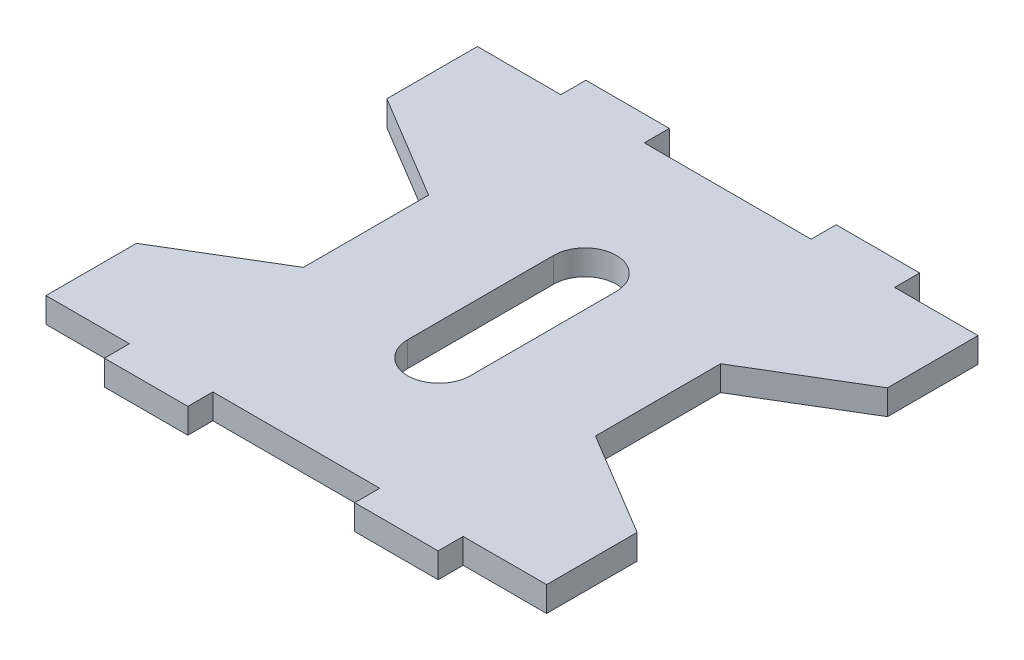
ISO-10303-21;
HEADER;
FILE_DESCRIPTION(('STEP AP214'),'2;1');
FILE_NAME('part.step','',(''),(''),'','','');
FILE_SCHEMA(('AUTOMOTIVE_DESIGN { 1 0 10303 214 1 1 1 1 }'));
ENDSEC;
DATA;
#1=APPLICATION_CONTEXT('core data for automotive mechanical design processes');
#2=APPLICATION_PROTOCOL_DEFINITION('international standard','automotive_design',2000,#1);
#3=PRODUCT_CONTEXT('',#1,'mechanical');
#4=PRODUCT('Part','Part','',(#3));
#5=PRODUCT_RELATED_PRODUCT_CATEGORY('part','',(#4));
#6=PRODUCT_DEFINITION_FORMATION('','',#4);
#7=PRODUCT_DEFINITION_CONTEXT('part definition',#1,'design');
#8=PRODUCT_DEFINITION('design','',#6,#7);
#9=PRODUCT_DEFINITION_SHAPE('','',#8);
#10=(LENGTH_UNIT() NAMED_UNIT(*) SI_UNIT(.MILLI.,.METRE.));
#11=(NAMED_UNIT(*) PLANE_ANGLE_UNIT() SI_UNIT($,.RADIAN.));
#12=(NAMED_UNIT(*) SI_UNIT($,.STERADIAN.) SOLID_ANGLE_UNIT());
#13=UNCERTAINTY_MEASURE_WITH_UNIT(LENGTH_MEASURE(1.E-05),#10,'distance_accuracy_value','');
#14=(GEOMETRIC_REPRESENTATION_CONTEXT(3) GLOBAL_UNCERTAINTY_ASSIGNED_CONTEXT((#13)) GLOBAL_UNIT_ASSIGNED_CONTEXT((#10,
#11,#12)) REPRESENTATION_CONTEXT('',''));
#15=CARTESIAN_POINT('',(0.,0.,0.));
#16=DIRECTION('',(0.,0.,1.));
#17=DIRECTION('',(1.,0.,0.));
#18=AXIS2_PLACEMENT_3D('',#15,#16,#17);
#19=CARTESIAN_POINT('',(0.,3.,0.));
#20=DIRECTION('',(0.,-1.,0.));
#21=DIRECTION('',(0.,0.,-1.));
#22=AXIS2_PLACEMENT_3D('',#19,#20,#21);
#23=PLANE('',#22);
#24=DIRECTION('',(0.,0.,1.));
#25=VECTOR('',#24,1.);
#26=CARTESIAN_POINT('',(10.,3.,-25.85));
#27=LINE('',#26,#25);
#28=CARTESIAN_POINT('',(10.,3.,-28.85));
#29=VERTEX_POINT('',#28);
#30=CARTESIAN_POINT('',(10.,3.,-25.85));
#31=VERTEX_POINT('',#30);
#32=EDGE_CURVE('E297',#29,#31,#27,.T.);
#33=ORIENTED_EDGE('',*,*,#32,.T.);
#34=DIRECTION('',(-1.,0.,0.));
#35=VECTOR('',#34,1.);
#36=CARTESIAN_POINT('',(-10.,3.,-25.85));
#37=LINE('',#36,#35);
#38=CARTESIAN_POINT('',(-10.,3.,-25.85));
#39=VERTEX_POINT('',#38);
#40=EDGE_CURVE('E301',#31,#39,#37,.T.);
#41=ORIENTED_EDGE('',*,*,#40,.T.);
#42=DIRECTION('',(0.,0.,-1.));
#43=VECTOR('',#42,1.);
#44=CARTESIAN_POINT('',(-10.,3.,-25.85));
#45=LINE('',#44,#43);
#46=CARTESIAN_POINT('',(-10.,3.,-28.85));
#47=VERTEX_POINT('',#46);
#48=EDGE_CURVE('E305',#39,#47,#45,.T.);
#49=ORIENTED_EDGE('',*,*,#48,.T.);
#50=DIRECTION('',(-1.,0.,0.));
#51=VECTOR('',#50,1.);
#52=CARTESIAN_POINT('',(-10.,3.,-28.85));
#53=LINE('',#52,#51);
#54=CARTESIAN_POINT('',(-20.,3.,-28.85));
#55=VERTEX_POINT('',#54);
#56=EDGE_CURVE('E308',#47,#55,#53,.T.);
#57=ORIENTED_EDGE('',*,*,#56,.T.);
#58=DIRECTION('',(0.,0.,1.));
#59=VECTOR('',#58,1.);
#60=CARTESIAN_POINT('',(-20.,3.,-28.85));
#61=LINE('',#60,#59);
#62=CARTESIAN_POINT('',(-20.,3.,-25.85));
#63=VERTEX_POINT('',#62);
#64=EDGE_CURVE('E311',#55,#63,#61,.T.);
#65=ORIENTED_EDGE('',*,*,#64,.T.);
#66=DIRECTION('',(-1.,0.,0.));
#67=VECTOR('',#66,1.);
#68=CARTESIAN_POINT('',(-20.,3.,-25.85));
#69=LINE('',#68,#67);
#70=CARTESIAN_POINT('',(-30.,3.,-25.85));
#71=VERTEX_POINT('',#70);
#72=EDGE_CURVE('E314',#63,#71,#69,.T.);
#73=ORIENTED_EDGE('',*,*,#72,.T.);
#74=DIRECTION('',(0.,0.,1.));
#75=VECTOR('',#74,1.);
#76=CARTESIAN_POINT('',(-30.,3.,-25.85));
#77=LINE('',#76,#75);
#78=CARTESIAN_POINT('',(-30.,3.,-15.));
#79=VERTEX_POINT('',#78);
#80=EDGE_CURVE('E317',#71,#79,#77,.T.);
#81=ORIENTED_EDGE('',*,*,#80,.T.);
#82=DIRECTION('',(0.857492925712544,0.,0.514495755427526));
#83=VECTOR('',#82,1.);
#84=CARTESIAN_POINT('',(-30.,3.,-15.));
#85=LINE('',#84,#83);
#86=CARTESIAN_POINT('',(-17.5,3.,-7.5));
#87=VERTEX_POINT('',#86);
#88=EDGE_CURVE('E320',#79,#87,#85,.T.);
#89=ORIENTED_EDGE('',*,*,#88,.T.);
#90=DIRECTION('',(0.,0.,1.));
#91=VECTOR('',#90,1.);
#92=CARTESIAN_POINT('',(-17.5,3.,-7.5));
#93=LINE('',#92,#91);
#94=CARTESIAN_POINT('',(-17.5,3.,7.5));
#95=VERTEX_POINT('',#94);
#96=EDGE_CURVE('E323',#87,#95,#93,.T.);
#97=ORIENTED_EDGE('',*,*,#96,.T.);
#98=DIRECTION('',(-0.857492925712544,0.,0.514495755427527));
#99=VECTOR('',#98,1.);
#100=CARTESIAN_POINT('',(-30.,3.,15.));
#101=LINE('',#100,#99);
#102=CARTESIAN_POINT('',(-30.,3.,15.));
#103=VERTEX_POINT('',#102);
#104=EDGE_CURVE('E326',#95,#103,#101,.T.);
#105=ORIENTED_EDGE('',*,*,#104,.T.);
#106=DIRECTION('',(0.,0.,1.));
#107=VECTOR('',#106,1.);
#108=CARTESIAN_POINT('',(-30.,3.,25.85));
#109=LINE('',#108,#107);
#110=CARTESIAN_POINT('',(-30.,3.,25.85));
#111=VERTEX_POINT('',#110);
#112=EDGE_CURVE('E329',#103,#111,#109,.T.);
#113=ORIENTED_EDGE('',*,*,#112,.T.);
#114=DIRECTION('',(1.,0.,0.));
#115=VECTOR('',#114,1.);
#116=CARTESIAN_POINT('',(-20.,3.,25.85));
#117=LINE('',#116,#115);
#118=CARTESIAN_POINT('',(-20.,3.,25.85));
#119=VERTEX_POINT('',#118);
#120=EDGE_CURVE('E332',#111,#119,#117,.T.);
#121=ORIENTED_EDGE('',*,*,#120,.T.);
#122=DIRECTION('',(0.,0.,1.));
#123=VECTOR('',#122,1.);
#124=CARTESIAN_POINT('',(-20.,3.,28.85));
#125=LINE('',#124,#123);
#126=CARTESIAN_POINT('',(-20.,3.,28.85));
#127=VERTEX_POINT('',#126);
#128=EDGE_CURVE('E335',#119,#127,#125,.T.);
#129=ORIENTED_EDGE('',*,*,#128,.T.);
#130=DIRECTION('',(1.,0.,0.));
#131=VECTOR('',#130,1.);
#132=CARTESIAN_POINT('',(-10.,3.,28.85));
#133=LINE('',#132,#131);
#134=CARTESIAN_POINT('',(-10.,3.,28.85));
#135=VERTEX_POINT('',#134);
#136=EDGE_CURVE('E338',#127,#135,#133,.T.);
#137=ORIENTED_EDGE('',*,*,#136,.T.);
#138=DIRECTION('',(0.,0.,-1.));
#139=VECTOR('',#138,1.);
#140=CARTESIAN_POINT('',(-10.,3.,25.85));
#141=LINE('',#140,#139);
#142=CARTESIAN_POINT('',(-10.,3.,25.85));
#143=VERTEX_POINT('',#142);
#144=EDGE_CURVE('E341',#135,#143,#141,.T.);
#145=ORIENTED_EDGE('',*,*,#144,.T.);
#146=DIRECTION('',(1.,0.,0.));
#147=VECTOR('',#146,1.);
#148=CARTESIAN_POINT('',(-10.,3.,25.85));
#149=LINE('',#148,#147);
#150=CARTESIAN_POINT('',(10.,3.,25.85));
#151=VERTEX_POINT('',#150);
#152=EDGE_CURVE('E344',#143,#151,#149,.T.);
#153=ORIENTED_EDGE('',*,*,#152,.T.);
#154=DIRECTION('',(0.,0.,1.));
#155=VECTOR('',#154,1.);
#156=CARTESIAN_POINT('',(10.,3.,25.85));
#157=LINE('',#156,#155);
#158=CARTESIAN_POINT('',(10.,3.,28.85));
#159=VERTEX_POINT('',#158);
#160=EDGE_CURVE('E347',#151,#159,#157,.T.);
#161=ORIENTED_EDGE('',*,*,#160,.T.);
#162=DIRECTION('',(1.,0.,0.));
#163=VECTOR('',#162,1.);
#164=CARTESIAN_POINT('',(10.,3.,28.85));
#165=LINE('',#164,#163);
#166=CARTESIAN_POINT('',(20.,3.,28.85));
#167=VERTEX_POINT('',#166);
#168=EDGE_CURVE('E350',#159,#167,#165,.T.);
#169=ORIENTED_EDGE('',*,*,#168,.T.);
#170=DIRECTION('',(0.,0.,-1.));
#171=VECTOR('',#170,1.);
#172=CARTESIAN_POINT('',(20.,3.,28.85));
#173=LINE('',#172,#171);
#174=CARTESIAN_POINT('',(20.,3.,25.85));
#175=VERTEX_POINT('',#174);
#176=EDGE_CURVE('E353',#167,#175,#173,.T.);
#177=ORIENTED_EDGE('',*,*,#176,.T.);
#178=DIRECTION('',(1.,0.,0.));
#179=VECTOR('',#178,1.);
#180=CARTESIAN_POINT('',(20.,3.,25.85));
#181=LINE('',#180,#179);
#182=CARTESIAN_POINT('',(30.,3.,25.85));
#183=VERTEX_POINT('',#182);
#184=EDGE_CURVE('E356',#175,#183,#181,.T.);
#185=ORIENTED_EDGE('',*,*,#184,.T.);
#186=DIRECTION('',(0.,0.,-1.));
#187=VECTOR('',#186,1.);
#188=CARTESIAN_POINT('',(30.,3.,25.85));
#189=LINE('',#188,#187);
#190=CARTESIAN_POINT('',(30.,3.,15.));
#191=VERTEX_POINT('',#190);
#192=EDGE_CURVE('E359',#183,#191,#189,.T.);
#193=ORIENTED_EDGE('',*,*,#192,.T.);
#194=DIRECTION('',(-0.857492925712544,0.,-0.514495755427526));
#195=VECTOR('',#194,1.);
#196=CARTESIAN_POINT('',(30.,3.,15.));
#197=LINE('',#196,#195);
#198=CARTESIAN_POINT('',(17.5,3.,7.49999999999999));
#199=VERTEX_POINT('',#198);
#200=EDGE_CURVE('E362',#191,#199,#197,.T.);
#201=ORIENTED_EDGE('',*,*,#200,.T.);
#202=DIRECTION('',(0.,0.,-1.));
#203=VECTOR('',#202,1.);
#204=CARTESIAN_POINT('',(17.5,3.,-7.5));
#205=LINE('',#204,#203);
#206=CARTESIAN_POINT('',(17.5,3.,-7.5));
#207=VERTEX_POINT('',#206);
#208=EDGE_CURVE('E365',#199,#207,#205,.T.);
#209=ORIENTED_EDGE('',*,*,#208,.T.);
#210=DIRECTION('',(0.857492925712544,0.,-0.514495755427526));
#211=VECTOR('',#210,1.);
#212=CARTESIAN_POINT('',(30.,3.,-15.));
#213=LINE('',#212,#211);
#214=CARTESIAN_POINT('',(30.,3.,-15.));
#215=VERTEX_POINT('',#214);
#216=EDGE_CURVE('E368',#207,#215,#213,.T.);
#217=ORIENTED_EDGE('',*,*,#216,.T.);
#218=DIRECTION('',(0.,0.,-1.));
#219=VECTOR('',#218,1.);
#220=CARTESIAN_POINT('',(30.,3.,-25.85));
#221=LINE('',#220,#219);
#222=CARTESIAN_POINT('',(30.,3.,-25.85));
#223=VERTEX_POINT('',#222);
#224=EDGE_CURVE('E371',#215,#223,#221,.T.);
#225=ORIENTED_EDGE('',*,*,#224,.T.);
#226=DIRECTION('',(-1.,0.,0.));
#227=VECTOR('',#226,1.);
#228=CARTESIAN_POINT('',(20.,3.,-25.85));
#229=LINE('',#228,#227);
#230=CARTESIAN_POINT('',(20.,3.,-25.85));
#231=VERTEX_POINT('',#230);
#232=EDGE_CURVE('E374',#223,#231,#229,.T.);
#233=ORIENTED_EDGE('',*,*,#232,.T.);
#234=DIRECTION('',(0.,0.,-1.));
#235=VECTOR('',#234,1.);
#236=CARTESIAN_POINT('',(20.,3.,-28.85));
#237=LINE('',#236,#235);
#238=CARTESIAN_POINT('',(20.,3.,-28.85));
#239=VERTEX_POINT('',#238);
#240=EDGE_CURVE('E377',#231,#239,#237,.T.);
#241=ORIENTED_EDGE('',*,*,#240,.T.);
#242=DIRECTION('',(-1.,0.,0.));
#243=VECTOR('',#242,1.);
#244=CARTESIAN_POINT('',(10.,3.,-28.85));
#245=LINE('',#244,#243);
#246=EDGE_CURVE('E380',#239,#29,#245,.T.);
#247=ORIENTED_EDGE('',*,*,#246,.T.);
#248=EDGE_LOOP('',(#33,#41,#49,#57,#65,#73,#81,#89,#97,#105,#113,#121,#129,#137,#145,#153,#161,
#169,#177,#185,#193,#201,#209,#217,#225,#233,#241,#247));
#249=FACE_BOUND('',#248,.T.);
#250=CARTESIAN_POINT('',(0.,3.,8.75));
#251=DIRECTION('',(0.,1.,0.));
#252=DIRECTION('',(0.,0.,-1.));
#253=AXIS2_PLACEMENT_3D('',#250,#251,#252);
#254=CIRCLE('',#253,3.75000000000001);
#255=CARTESIAN_POINT('',(-3.75000000000002,3.,8.75));
#256=VERTEX_POINT('',#255);
#257=CARTESIAN_POINT('',(3.75,3.,8.75));
#258=VERTEX_POINT('',#257);
#259=EDGE_CURVE('E249',#256,#258,#254,.T.);
#260=ORIENTED_EDGE('',*,*,#259,.F.);
#261=DIRECTION('',(0.,0.,1.));
#262=VECTOR('',#261,1.);
#263=CARTESIAN_POINT('',(-3.75000000000002,3.,8.75));
#264=LINE('',#263,#262);
#265=CARTESIAN_POINT('',(-3.75000000000002,3.,-8.75));
#266=VERTEX_POINT('',#265);
#267=EDGE_CURVE('E275',#266,#256,#264,.T.);
#268=ORIENTED_EDGE('',*,*,#267,.F.);
#269=CARTESIAN_POINT('',(0.,3.,-8.75));
#270=DIRECTION('',(0.,1.,0.));
#271=DIRECTION('',(0.,0.,1.));
#272=AXIS2_PLACEMENT_3D('',#269,#270,#271);
#273=CIRCLE('',#272,3.75000000000001);
#274=CARTESIAN_POINT('',(3.75,3.,-8.75));
#275=VERTEX_POINT('',#274);
#276=EDGE_CURVE('E271',#275,#266,#273,.T.);
#277=ORIENTED_EDGE('',*,*,#276,.F.);
#278=DIRECTION('',(0.,0.,-1.));
#279=VECTOR('',#278,1.);
#280=CARTESIAN_POINT('',(3.75,3.,8.75));
#281=LINE('',#280,#279);
#282=EDGE_CURVE('E258',#258,#275,#281,.T.);
#283=ORIENTED_EDGE('',*,*,#282,.F.);
#284=EDGE_LOOP('',(#260,#268,#277,#283));
#285=FACE_BOUND('',#284,.T.);
#286=ADVANCED_FACE('F39',(#249,#285),#23,.F.);
#287=CARTESIAN_POINT('',(0.,0.,0.));
#288=DIRECTION('',(0.,-1.,0.));
#289=DIRECTION('',(0.,0.,-1.));
#290=AXIS2_PLACEMENT_3D('',#287,#288,#289);
#291=PLANE('',#290);
#292=DIRECTION('',(0.,0.,1.));
#293=VECTOR('',#292,1.);
#294=CARTESIAN_POINT('',(10.,0.,-25.85));
#295=LINE('',#294,#293);
#296=CARTESIAN_POINT('',(10.,0.,-28.85));
#297=VERTEX_POINT('',#296);
#298=CARTESIAN_POINT('',(10.,0.,-25.85));
#299=VERTEX_POINT('',#298);
#300=EDGE_CURVE('E267',#297,#299,#295,.T.);
#301=ORIENTED_EDGE('',*,*,#300,.F.);
#302=DIRECTION('',(-1.,0.,0.));
#303=VECTOR('',#302,1.);
#304=CARTESIAN_POINT('',(10.,0.,-28.85));
#305=LINE('',#304,#303);
#306=CARTESIAN_POINT('',(20.,0.,-28.85));
#307=VERTEX_POINT('',#306);
#308=EDGE_CURVE('E302',#307,#297,#305,.T.);
#309=ORIENTED_EDGE('',*,*,#308,.F.);
#310=DIRECTION('',(0.,0.,-1.));
#311=VECTOR('',#310,1.);
#312=CARTESIAN_POINT('',(20.,0.,-28.85));
#313=LINE('',#312,#311);
#314=CARTESIAN_POINT('',(20.,0.,-25.85));
#315=VERTEX_POINT('',#314);
#316=EDGE_CURVE('E462',#315,#307,#313,.T.);
#317=ORIENTED_EDGE('',*,*,#316,.F.);
#318=DIRECTION('',(-1.,0.,0.));
#319=VECTOR('',#318,1.);
#320=CARTESIAN_POINT('',(20.,0.,-25.85));
#321=LINE('',#320,#319);
#322=CARTESIAN_POINT('',(30.,0.,-25.85));
#323=VERTEX_POINT('',#322);
#324=EDGE_CURVE('E459',#323,#315,#321,.T.);
#325=ORIENTED_EDGE('',*,*,#324,.F.);
#326=DIRECTION('',(0.,0.,-1.));
#327=VECTOR('',#326,1.);
#328=CARTESIAN_POINT('',(30.,0.,-25.85));
#329=LINE('',#328,#327);
#330=CARTESIAN_POINT('',(30.,0.,-15.));
#331=VERTEX_POINT('',#330);
#332=EDGE_CURVE('E456',#331,#323,#329,.T.);
#333=ORIENTED_EDGE('',*,*,#332,.F.);
#334=DIRECTION('',(0.857492925712544,0.,-0.514495755427526));
#335=VECTOR('',#334,1.);
#336=CARTESIAN_POINT('',(30.,0.,-15.));
#337=LINE('',#336,#335);
#338=CARTESIAN_POINT('',(17.5,0.,-7.5));
#339=VERTEX_POINT('',#338);
#340=EDGE_CURVE('E453',#339,#331,#337,.T.);
#341=ORIENTED_EDGE('',*,*,#340,.F.);
#342=DIRECTION('',(0.,0.,-1.));
#343=VECTOR('',#342,1.);
#344=CARTESIAN_POINT('',(17.5,0.,-7.5));
#345=LINE('',#344,#343);
#346=CARTESIAN_POINT('',(17.5,0.,7.49999999999999));
#347=VERTEX_POINT('',#346);
#348=EDGE_CURVE('E450',#347,#339,#345,.T.);
#349=ORIENTED_EDGE('',*,*,#348,.F.);
#350=DIRECTION('',(-0.857492925712544,0.,-0.514495755427526));
#351=VECTOR('',#350,1.);
#352=CARTESIAN_POINT('',(30.,0.,15.));
#353=LINE('',#352,#351);
#354=CARTESIAN_POINT('',(30.,0.,15.));
#355=VERTEX_POINT('',#354);
#356=EDGE_CURVE('E447',#355,#347,#353,.T.);
#357=ORIENTED_EDGE('',*,*,#356,.F.);
#358=DIRECTION('',(0.,0.,-1.));
#359=VECTOR('',#358,1.);
#360=CARTESIAN_POINT('',(30.,0.,25.85));
#361=LINE('',#360,#359);
#362=CARTESIAN_POINT('',(30.,0.,25.85));
#363=VERTEX_POINT('',#362);
#364=EDGE_CURVE('E444',#363,#355,#361,.T.);
#365=ORIENTED_EDGE('',*,*,#364,.F.);
#366=DIRECTION('',(1.,0.,0.));
#367=VECTOR('',#366,1.);
#368=CARTESIAN_POINT('',(20.,0.,25.85));
#369=LINE('',#368,#367);
#370=CARTESIAN_POINT('',(20.,0.,25.85));
#371=VERTEX_POINT('',#370);
#372=EDGE_CURVE('E441',#371,#363,#369,.T.);
#373=ORIENTED_EDGE('',*,*,#372,.F.);
#374=DIRECTION('',(0.,0.,-1.));
#375=VECTOR('',#374,1.);
#376=CARTESIAN_POINT('',(20.,0.,28.85));
#377=LINE('',#376,#375);
#378=CARTESIAN_POINT('',(20.,0.,28.85));
#379=VERTEX_POINT('',#378);
#380=EDGE_CURVE('E438',#379,#371,#377,.T.);
#381=ORIENTED_EDGE('',*,*,#380,.F.);
#382=DIRECTION('',(1.,0.,0.));
#383=VECTOR('',#382,1.);
#384=CARTESIAN_POINT('',(10.,0.,28.85));
#385=LINE('',#384,#383);
#386=CARTESIAN_POINT('',(10.,0.,28.85));
#387=VERTEX_POINT('',#386);
#388=EDGE_CURVE('E435',#387,#379,#385,.T.);
#389=ORIENTED_EDGE('',*,*,#388,.F.);
#390=DIRECTION('',(0.,0.,1.));
#391=VECTOR('',#390,1.);
#392=CARTESIAN_POINT('',(10.,0.,25.85));
#393=LINE('',#392,#391);
#394=CARTESIAN_POINT('',(10.,0.,25.85));
#395=VERTEX_POINT('',#394);
#396=EDGE_CURVE('E432',#395,#387,#393,.T.);
#397=ORIENTED_EDGE('',*,*,#396,.F.);
#398=DIRECTION('',(1.,0.,0.));
#399=VECTOR('',#398,1.);
#400=CARTESIAN_POINT('',(-10.,0.,25.85));
#401=LINE('',#400,#399);
#402=CARTESIAN_POINT('',(-10.,0.,25.85));
#403=VERTEX_POINT('',#402);
#404=EDGE_CURVE('E429',#403,#395,#401,.T.);
#405=ORIENTED_EDGE('',*,*,#404,.F.);
#406=DIRECTION('',(0.,0.,-1.));
#407=VECTOR('',#406,1.);
#408=CARTESIAN_POINT('',(-10.,0.,25.85));
#409=LINE('',#408,#407);
#410=CARTESIAN_POINT('',(-10.,0.,28.85));
#411=VERTEX_POINT('',#410);
#412=EDGE_CURVE('E426',#411,#403,#409,.T.);
#413=ORIENTED_EDGE('',*,*,#412,.F.);
#414=DIRECTION('',(1.,0.,0.));
#415=VECTOR('',#414,1.);
#416=CARTESIAN_POINT('',(-10.,0.,28.85));
#417=LINE('',#416,#415);
#418=CARTESIAN_POINT('',(-20.,0.,28.85));
#419=VERTEX_POINT('',#418);
#420=EDGE_CURVE('E423',#419,#411,#417,.T.);
#421=ORIENTED_EDGE('',*,*,#420,.F.);
#422=DIRECTION('',(0.,0.,1.));
#423=VECTOR('',#422,1.);
#424=CARTESIAN_POINT('',(-20.,0.,28.85));
#425=LINE('',#424,#423);
#426=CARTESIAN_POINT('',(-20.,0.,25.85));
#427=VERTEX_POINT('',#426);
#428=EDGE_CURVE('E420',#427,#419,#425,.T.);
#429=ORIENTED_EDGE('',*,*,#428,.F.);
#430=DIRECTION('',(1.,0.,0.));
#431=VECTOR('',#430,1.);
#432=CARTESIAN_POINT('',(-20.,0.,25.85));
#433=LINE('',#432,#431);
#434=CARTESIAN_POINT('',(-30.,0.,25.85));
#435=VERTEX_POINT('',#434);
#436=EDGE_CURVE('E417',#435,#427,#433,.T.);
#437=ORIENTED_EDGE('',*,*,#436,.F.);
#438=DIRECTION('',(0.,0.,1.));
#439=VECTOR('',#438,1.);
#440=CARTESIAN_POINT('',(-30.,0.,25.85));
#441=LINE('',#440,#439);
#442=CARTESIAN_POINT('',(-30.,0.,15.));
#443=VERTEX_POINT('',#442);
#444=EDGE_CURVE('E414',#443,#435,#441,.T.);
#445=ORIENTED_EDGE('',*,*,#444,.F.);
#446=DIRECTION('',(-0.857492925712544,0.,0.514495755427527));
#447=VECTOR('',#446,1.);
#448=CARTESIAN_POINT('',(-30.,0.,15.));
#449=LINE('',#448,#447);
#450=CARTESIAN_POINT('',(-17.5,0.,7.5));
#451=VERTEX_POINT('',#450);
#452=EDGE_CURVE('E411',#451,#443,#449,.T.);
#453=ORIENTED_EDGE('',*,*,#452,.F.);
#454=DIRECTION('',(0.,0.,1.));
#455=VECTOR('',#454,1.);
#456=CARTESIAN_POINT('',(-17.5,0.,-7.5));
#457=LINE('',#456,#455);
#458=CARTESIAN_POINT('',(-17.5,0.,-7.5));
#459=VERTEX_POINT('',#458);
#460=EDGE_CURVE('E408',#459,#451,#457,.T.);
#461=ORIENTED_EDGE('',*,*,#460,.F.);
#462=DIRECTION('',(0.857492925712544,0.,0.514495755427526));
#463=VECTOR('',#462,1.);
#464=CARTESIAN_POINT('',(-30.,0.,-15.));
#465=LINE('',#464,#463);
#466=CARTESIAN_POINT('',(-30.,0.,-15.));
#467=VERTEX_POINT('',#466);
#468=EDGE_CURVE('E405',#467,#459,#465,.T.);
#469=ORIENTED_EDGE('',*,*,#468,.F.);
#470=DIRECTION('',(0.,0.,1.));
#471=VECTOR('',#470,1.);
#472=CARTESIAN_POINT('',(-30.,0.,-25.85));
#473=LINE('',#472,#471);
#474=CARTESIAN_POINT('',(-30.,0.,-25.85));
#475=VERTEX_POINT('',#474);
#476=EDGE_CURVE('E402',#475,#467,#473,.T.);
#477=ORIENTED_EDGE('',*,*,#476,.F.);
#478=DIRECTION('',(-1.,0.,0.));
#479=VECTOR('',#478,1.);
#480=CARTESIAN_POINT('',(-20.,0.,-25.85));
#481=LINE('',#480,#479);
#482=CARTESIAN_POINT('',(-20.,0.,-25.85));
#483=VERTEX_POINT('',#482);
#484=EDGE_CURVE('E399',#483,#475,#481,.T.);
#485=ORIENTED_EDGE('',*,*,#484,.F.);
#486=DIRECTION('',(0.,0.,1.));
#487=VECTOR('',#486,1.);
#488=CARTESIAN_POINT('',(-20.,0.,-28.85));
#489=LINE('',#488,#487);
#490=CARTESIAN_POINT('',(-20.,0.,-28.85));
#491=VERTEX_POINT('',#490);
#492=EDGE_CURVE('E396',#491,#483,#489,.T.);
#493=ORIENTED_EDGE('',*,*,#492,.F.);
#494=DIRECTION('',(-1.,0.,0.));
#495=VECTOR('',#494,1.);
#496=CARTESIAN_POINT('',(-10.,0.,-28.85));
#497=LINE('',#496,#495);
#498=CARTESIAN_POINT('',(-10.,0.,-28.85));
#499=VERTEX_POINT('',#498);
#500=EDGE_CURVE('E393',#499,#491,#497,.T.);
#501=ORIENTED_EDGE('',*,*,#500,.F.);
#502=DIRECTION('',(0.,0.,-1.));
#503=VECTOR('',#502,1.);
#504=CARTESIAN_POINT('',(-10.,0.,-25.85));
#505=LINE('',#504,#503);
#506=CARTESIAN_POINT('',(-10.,0.,-25.85));
#507=VERTEX_POINT('',#506);
#508=EDGE_CURVE('E390',#507,#499,#505,.T.);
#509=ORIENTED_EDGE('',*,*,#508,.F.);
#510=DIRECTION('',(-1.,0.,0.));
#511=VECTOR('',#510,1.);
#512=CARTESIAN_POINT('',(-10.,0.,-25.85));
#513=LINE('',#512,#511);
#514=EDGE_CURVE('E387',#299,#507,#513,.T.);
#515=ORIENTED_EDGE('',*,*,#514,.F.);
#516=EDGE_LOOP('',(#301,#309,#317,#325,#333,#341,#349,#357,#365,#373,#381,#389,#397,#405,#413,
#421,#429,#437,#445,#453,#461,#469,#477,#485,#493,#501,#509,#515));
#517=FACE_BOUND('',#516,.T.);
#518=DIRECTION('',(0.,0.,1.));
#519=VECTOR('',#518,1.);
#520=CARTESIAN_POINT('',(-3.75000000000002,0.,8.75));
#521=LINE('',#520,#519);
#522=CARTESIAN_POINT('',(-3.75000000000002,0.,-8.75));
#523=VERTEX_POINT('',#522);
#524=CARTESIAN_POINT('',(-3.75000000000002,0.,8.75));
#525=VERTEX_POINT('',#524);
#526=EDGE_CURVE('E259',#523,#525,#521,.T.);
#527=ORIENTED_EDGE('',*,*,#526,.T.);
#528=CARTESIAN_POINT('',(0.,0.,8.75));
#529=DIRECTION('',(0.,1.,0.));
#530=DIRECTION('',(0.,0.,-1.));
#531=AXIS2_PLACEMENT_3D('',#528,#529,#530);
#532=CIRCLE('',#531,3.75000000000001);
#533=CARTESIAN_POINT('',(3.75,0.,8.75));
#534=VERTEX_POINT('',#533);
#535=EDGE_CURVE('E63',#525,#534,#532,.T.);
#536=ORIENTED_EDGE('',*,*,#535,.T.);
#537=DIRECTION('',(0.,0.,-1.));
#538=VECTOR('',#537,1.);
#539=CARTESIAN_POINT('',(3.75,0.,8.75));
#540=LINE('',#539,#538);
#541=CARTESIAN_POINT('',(3.75,0.,-8.75));
#542=VERTEX_POINT('',#541);
#543=EDGE_CURVE('E265',#534,#542,#540,.T.);
#544=ORIENTED_EDGE('',*,*,#543,.T.);
#545=CARTESIAN_POINT('',(0.,0.,-8.75));
#546=DIRECTION('',(0.,1.,0.));
#547=DIRECTION('',(0.,0.,1.));
#548=AXIS2_PLACEMENT_3D('',#545,#546,#547);
#549=CIRCLE('',#548,3.75000000000001);
#550=EDGE_CURVE('E284',#542,#523,#549,.T.);
#551=ORIENTED_EDGE('',*,*,#550,.T.);
#552=EDGE_LOOP('',(#527,#536,#544,#551));
#553=FACE_BOUND('',#552,.T.);
#554=ADVANCED_FACE('F581',(#517,#553),#291,.T.);
#555=CARTESIAN_POINT('',(10.,3.,-25.85));
#556=DIRECTION('',(1.,0.,0.));
#557=DIRECTION('',(0.,0.,-1.));
#558=AXIS2_PLACEMENT_3D('',#555,#556,#557);
#559=PLANE('',#558);
#560=ORIENTED_EDGE('',*,*,#300,.T.);
#561=DIRECTION('',(0.,-1.,0.));
#562=VECTOR('',#561,1.);
#563=CARTESIAN_POINT('',(10.,3.,-25.85));
#564=LINE('',#563,#562);
#565=EDGE_CURVE('E11',#31,#299,#564,.T.);
#566=ORIENTED_EDGE('',*,*,#565,.F.);
#567=ORIENTED_EDGE('',*,*,#32,.F.);
#568=DIRECTION('',(0.,-1.,0.));
#569=VECTOR('',#568,1.);
#570=CARTESIAN_POINT('',(10.,3.,-28.85));
#571=LINE('',#570,#569);
#572=EDGE_CURVE('E383',#29,#297,#571,.T.);
#573=ORIENTED_EDGE('',*,*,#572,.T.);
#574=EDGE_LOOP('',(#560,#566,#567,#573));
#575=FACE_BOUND('',#574,.T.);
#576=ADVANCED_FACE('F41',(#575),#559,.F.);
#577=CARTESIAN_POINT('',(-10.,3.,-25.85));
#578=DIRECTION('',(0.,0.,1.));
#579=DIRECTION('',(1.,0.,0.));
#580=AXIS2_PLACEMENT_3D('',#577,#578,#579);
#581=PLANE('',#580);
#582=ORIENTED_EDGE('',*,*,#514,.T.);
#583=DIRECTION('',(0.,-1.,0.));
#584=VECTOR('',#583,1.);
#585=CARTESIAN_POINT('',(-10.,3.,-25.85));
#586=LINE('',#585,#584);
#587=EDGE_CURVE('E48',#39,#507,#586,.T.);
#588=ORIENTED_EDGE('',*,*,#587,.F.);
#589=ORIENTED_EDGE('',*,*,#40,.F.);
#590=ORIENTED_EDGE('',*,*,#565,.T.);
#591=EDGE_LOOP('',(#582,#588,#589,#590));
#592=FACE_BOUND('',#591,.T.);
#593=ADVANCED_FACE('F598',(#592),#581,.F.);
#594=CARTESIAN_POINT('',(-10.,3.,-25.85));
#595=DIRECTION('',(-1.,0.,0.));
#596=DIRECTION('',(0.,0.,1.));
#597=AXIS2_PLACEMENT_3D('',#594,#595,#596);
#598=PLANE('',#597);
#599=ORIENTED_EDGE('',*,*,#508,.T.);
#600=DIRECTION('',(0.,-1.,0.));
#601=VECTOR('',#600,1.);
#602=CARTESIAN_POINT('',(-10.,3.,-28.85));
#603=LINE('',#602,#601);
#604=EDGE_CURVE('E566',#47,#499,#603,.T.);
#605=ORIENTED_EDGE('',*,*,#604,.F.);
#606=ORIENTED_EDGE('',*,*,#48,.F.);
#607=ORIENTED_EDGE('',*,*,#587,.T.);
#608=EDGE_LOOP('',(#599,#605,#606,#607));
#609=FACE_BOUND('',#608,.T.);
#610=ADVANCED_FACE('F575',(#609),#598,.F.);
#611=CARTESIAN_POINT('',(-10.,3.,-28.85));
#612=DIRECTION('',(0.,0.,1.));
#613=DIRECTION('',(1.,0.,0.));
#614=AXIS2_PLACEMENT_3D('',#611,#612,#613);
#615=PLANE('',#614);
#616=ORIENTED_EDGE('',*,*,#500,.T.);
#617=DIRECTION('',(0.,-1.,0.));
#618=VECTOR('',#617,1.);
#619=CARTESIAN_POINT('',(-20.,3.,-28.85));
#620=LINE('',#619,#618);
#621=EDGE_CURVE('E562',#55,#491,#620,.T.);
#622=ORIENTED_EDGE('',*,*,#621,.F.);
#623=ORIENTED_EDGE('',*,*,#56,.F.);
#624=ORIENTED_EDGE('',*,*,#604,.T.);
#625=EDGE_LOOP('',(#616,#622,#623,#624));
#626=FACE_BOUND('',#625,.T.);
#627=ADVANCED_FACE('F587',(#626),#615,.F.);
#628=CARTESIAN_POINT('',(-20.,3.,-28.85));
#629=DIRECTION('',(1.,0.,0.));
#630=DIRECTION('',(0.,0.,-1.));
#631=AXIS2_PLACEMENT_3D('',#628,#629,#630);
#632=PLANE('',#631);
#633=ORIENTED_EDGE('',*,*,#492,.T.);
#634=DIRECTION('',(0.,-1.,0.));
#635=VECTOR('',#634,1.);
#636=CARTESIAN_POINT('',(-20.,3.,-25.85));
#637=LINE('',#636,#635);
#638=EDGE_CURVE('E558',#63,#483,#637,.T.);
#639=ORIENTED_EDGE('',*,*,#638,.F.);
#640=ORIENTED_EDGE('',*,*,#64,.F.);
#641=ORIENTED_EDGE('',*,*,#621,.T.);
#642=EDGE_LOOP('',(#633,#639,#640,#641));
#643=FACE_BOUND('',#642,.T.);
#644=ADVANCED_FACE('F591',(#643),#632,.F.);
#645=CARTESIAN_POINT('',(-20.,3.,-25.85));
#646=DIRECTION('',(0.,0.,1.));
#647=DIRECTION('',(1.,0.,0.));
#648=AXIS2_PLACEMENT_3D('',#645,#646,#647);
#649=PLANE('',#648);
#650=ORIENTED_EDGE('',*,*,#484,.T.);
#651=DIRECTION('',(0.,-1.,0.));
#652=VECTOR('',#651,1.);
#653=CARTESIAN_POINT('',(-30.,3.,-25.85));
#654=LINE('',#653,#652);
#655=EDGE_CURVE('E554',#71,#475,#654,.T.);
#656=ORIENTED_EDGE('',*,*,#655,.F.);
#657=ORIENTED_EDGE('',*,*,#72,.F.);
#658=ORIENTED_EDGE('',*,*,#638,.T.);
#659=EDGE_LOOP('',(#650,#656,#657,#658));
#660=FACE_BOUND('',#659,.T.);
#661=ADVANCED_FACE('F711',(#660),#649,.F.);
#662=CARTESIAN_POINT('',(-30.,3.,-25.85));
#663=DIRECTION('',(1.,0.,0.));
#664=DIRECTION('',(0.,0.,-1.));
#665=AXIS2_PLACEMENT_3D('',#662,#663,#664);
#666=PLANE('',#665);
#667=ORIENTED_EDGE('',*,*,#476,.T.);
#668=DIRECTION('',(0.,-1.,0.));
#669=VECTOR('',#668,1.);
#670=CARTESIAN_POINT('',(-30.,3.,-15.));
#671=LINE('',#670,#669);
#672=EDGE_CURVE('E550',#79,#467,#671,.T.);
#673=ORIENTED_EDGE('',*,*,#672,.F.);
#674=ORIENTED_EDGE('',*,*,#80,.F.);
#675=ORIENTED_EDGE('',*,*,#655,.T.);
#676=EDGE_LOOP('',(#667,#673,#674,#675));
#677=FACE_BOUND('',#676,.T.);
#678=ADVANCED_FACE('F708',(#677),#666,.F.);
#679=CARTESIAN_POINT('',(-30.,3.,-15.));
#680=DIRECTION('',(0.514495755427526,0.,-0.857492925712544));
#681=DIRECTION('',(-0.857492925712544,0.,-0.514495755427526));
#682=AXIS2_PLACEMENT_3D('',#679,#680,#681);
#683=PLANE('',#682);
#684=ORIENTED_EDGE('',*,*,#468,.T.);
#685=DIRECTION('',(0.,-1.,0.));
#686=VECTOR('',#685,1.);
#687=CARTESIAN_POINT('',(-17.5,3.,-7.5));
#688=LINE('',#687,#686);
#689=EDGE_CURVE('E546',#87,#459,#688,.T.);
#690=ORIENTED_EDGE('',*,*,#689,.F.);
#691=ORIENTED_EDGE('',*,*,#88,.F.);
#692=ORIENTED_EDGE('',*,*,#672,.T.);
#693=EDGE_LOOP('',(#684,#690,#691,#692));
#694=FACE_BOUND('',#693,.T.);
#695=ADVANCED_FACE('F704',(#694),#683,.F.);
#696=CARTESIAN_POINT('',(-17.5,3.,-7.5));
#697=DIRECTION('',(1.,0.,0.));
#698=DIRECTION('',(0.,0.,-1.));
#699=AXIS2_PLACEMENT_3D('',#696,#697,#698);
#700=PLANE('',#699);
#701=ORIENTED_EDGE('',*,*,#460,.T.);
#702=DIRECTION('',(0.,-1.,0.));
#703=VECTOR('',#702,1.);
#704=CARTESIAN_POINT('',(-17.5,3.,7.5));
#705=LINE('',#704,#703);
#706=EDGE_CURVE('E542',#95,#451,#705,.T.);
#707=ORIENTED_EDGE('',*,*,#706,.F.);
#708=ORIENTED_EDGE('',*,*,#96,.F.);
#709=ORIENTED_EDGE('',*,*,#689,.T.);
#710=EDGE_LOOP('',(#701,#707,#708,#709));
#711=FACE_BOUND('',#710,.T.);
#712=ADVANCED_FACE('F700',(#711),#700,.F.);
#713=CARTESIAN_POINT('',(-30.,3.,15.));
#714=DIRECTION('',(0.514495755427526,0.,0.857492925712544));
#715=DIRECTION('',(0.857492925712544,0.,-0.514495755427527));
#716=AXIS2_PLACEMENT_3D('',#713,#714,#715);
#717=PLANE('',#716);
#718=ORIENTED_EDGE('',*,*,#452,.T.);
#719=DIRECTION('',(0.,-1.,0.));
#720=VECTOR('',#719,1.);
#721=CARTESIAN_POINT('',(-30.,3.,15.));
#722=LINE('',#721,#720);
#723=EDGE_CURVE('E538',#103,#443,#722,.T.);
#724=ORIENTED_EDGE('',*,*,#723,.F.);
#725=ORIENTED_EDGE('',*,*,#104,.F.);
#726=ORIENTED_EDGE('',*,*,#706,.T.);
#727=EDGE_LOOP('',(#718,#724,#725,#726));
#728=FACE_BOUND('',#727,.T.);
#729=ADVANCED_FACE('F695',(#728),#717,.F.);
#730=CARTESIAN_POINT('',(-30.,3.,25.85));
#731=DIRECTION('',(1.,0.,0.));
#732=DIRECTION('',(0.,0.,-1.));
#733=AXIS2_PLACEMENT_3D('',#730,#731,#732);
#734=PLANE('',#733);
#735=ORIENTED_EDGE('',*,*,#444,.T.);
#736=DIRECTION('',(0.,-1.,0.));
#737=VECTOR('',#736,1.);
#738=CARTESIAN_POINT('',(-30.,3.,25.85));
#739=LINE('',#738,#737);
#740=EDGE_CURVE('E534',#111,#435,#739,.T.);
#741=ORIENTED_EDGE('',*,*,#740,.F.);
#742=ORIENTED_EDGE('',*,*,#112,.F.);
#743=ORIENTED_EDGE('',*,*,#723,.T.);
#744=EDGE_LOOP('',(#735,#741,#742,#743));
#745=FACE_BOUND('',#744,.T.);
#746=ADVANCED_FACE('F689',(#745),#734,.F.);
#747=CARTESIAN_POINT('',(-20.,3.,25.85));
#748=DIRECTION('',(0.,0.,-1.));
#749=DIRECTION('',(-1.,0.,0.));
#750=AXIS2_PLACEMENT_3D('',#747,#748,#749);
#751=PLANE('',#750);
#752=ORIENTED_EDGE('',*,*,#436,.T.);
#753=DIRECTION('',(0.,-1.,0.));
#754=VECTOR('',#753,1.);
#755=CARTESIAN_POINT('',(-20.,3.,25.85));
#756=LINE('',#755,#754);
#757=EDGE_CURVE('E530',#119,#427,#756,.T.);
#758=ORIENTED_EDGE('',*,*,#757,.F.);
#759=ORIENTED_EDGE('',*,*,#120,.F.);
#760=ORIENTED_EDGE('',*,*,#740,.T.);
#761=EDGE_LOOP('',(#752,#758,#759,#760));
#762=FACE_BOUND('',#761,.T.);
#763=ADVANCED_FACE('F685',(#762),#751,.F.);
#764=CARTESIAN_POINT('',(-20.,3.,28.85));
#765=DIRECTION('',(1.,0.,0.));
#766=DIRECTION('',(0.,0.,-1.));
#767=AXIS2_PLACEMENT_3D('',#764,#765,#766);
#768=PLANE('',#767);
#769=ORIENTED_EDGE('',*,*,#428,.T.);
#770=DIRECTION('',(0.,-1.,0.));
#771=VECTOR('',#770,1.);
#772=CARTESIAN_POINT('',(-20.,3.,28.85));
#773=LINE('',#772,#771);
#774=EDGE_CURVE('E526',#127,#419,#773,.T.);
#775=ORIENTED_EDGE('',*,*,#774,.F.);
#776=ORIENTED_EDGE('',*,*,#128,.F.);
#777=ORIENTED_EDGE('',*,*,#757,.T.);
#778=EDGE_LOOP('',(#769,#775,#776,#777));
#779=FACE_BOUND('',#778,.T.);
#780=ADVANCED_FACE('F680',(#779),#768,.F.);
#781=CARTESIAN_POINT('',(-10.,3.,28.85));
#782=DIRECTION('',(0.,0.,-1.));
#783=DIRECTION('',(-1.,0.,0.));
#784=AXIS2_PLACEMENT_3D('',#781,#782,#783);
#785=PLANE('',#784);
#786=ORIENTED_EDGE('',*,*,#420,.T.);
#787=DIRECTION('',(0.,-1.,0.));
#788=VECTOR('',#787,1.);
#789=CARTESIAN_POINT('',(-10.,3.,28.85));
#790=LINE('',#789,#788);
#791=EDGE_CURVE('E522',#135,#411,#790,.T.);
#792=ORIENTED_EDGE('',*,*,#791,.F.);
#793=ORIENTED_EDGE('',*,*,#136,.F.);
#794=ORIENTED_EDGE('',*,*,#774,.T.);
#795=EDGE_LOOP('',(#786,#792,#793,#794));
#796=FACE_BOUND('',#795,.T.);
#797=ADVANCED_FACE('F674',(#796),#785,.F.);
#798=CARTESIAN_POINT('',(-10.,3.,25.85));
#799=DIRECTION('',(-1.,0.,0.));
#800=DIRECTION('',(0.,0.,1.));
#801=AXIS2_PLACEMENT_3D('',#798,#799,#800);
#802=PLANE('',#801);
#803=ORIENTED_EDGE('',*,*,#412,.T.);
#804=DIRECTION('',(0.,-1.,0.));
#805=VECTOR('',#804,1.);
#806=CARTESIAN_POINT('',(-10.,3.,25.85));
#807=LINE('',#806,#805);
#808=EDGE_CURVE('E518',#143,#403,#807,.T.);
#809=ORIENTED_EDGE('',*,*,#808,.F.);
#810=ORIENTED_EDGE('',*,*,#144,.F.);
#811=ORIENTED_EDGE('',*,*,#791,.T.);
#812=EDGE_LOOP('',(#803,#809,#810,#811));
#813=FACE_BOUND('',#812,.T.);
#814=ADVANCED_FACE('F670',(#813),#802,.F.);
#815=CARTESIAN_POINT('',(-10.,3.,25.85));
#816=DIRECTION('',(0.,0.,-1.));
#817=DIRECTION('',(-1.,0.,0.));
#818=AXIS2_PLACEMENT_3D('',#815,#816,#817);
#819=PLANE('',#818);
#820=ORIENTED_EDGE('',*,*,#404,.T.);
#821=DIRECTION('',(0.,-1.,0.));
#822=VECTOR('',#821,1.);
#823=CARTESIAN_POINT('',(10.,3.,25.85));
#824=LINE('',#823,#822);
#825=EDGE_CURVE('E514',#151,#395,#824,.T.);
#826=ORIENTED_EDGE('',*,*,#825,.F.);
#827=ORIENTED_EDGE('',*,*,#152,.F.);
#828=ORIENTED_EDGE('',*,*,#808,.T.);
#829=EDGE_LOOP('',(#820,#826,#827,#828));
#830=FACE_BOUND('',#829,.T.);
#831=ADVANCED_FACE('F665',(#830),#819,.F.);
#832=CARTESIAN_POINT('',(10.,3.,25.85));
#833=DIRECTION('',(1.,0.,0.));
#834=DIRECTION('',(0.,0.,-1.));
#835=AXIS2_PLACEMENT_3D('',#832,#833,#834);
#836=PLANE('',#835);
#837=ORIENTED_EDGE('',*,*,#396,.T.);
#838=DIRECTION('',(0.,-1.,0.));
#839=VECTOR('',#838,1.);
#840=CARTESIAN_POINT('',(10.,3.,28.85));
#841=LINE('',#840,#839);
#842=EDGE_CURVE('E510',#159,#387,#841,.T.);
#843=ORIENTED_EDGE('',*,*,#842,.F.);
#844=ORIENTED_EDGE('',*,*,#160,.F.);
#845=ORIENTED_EDGE('',*,*,#825,.T.);
#846=EDGE_LOOP('',(#837,#843,#844,#845));
#847=FACE_BOUND('',#846,.T.);
#848=ADVANCED_FACE('F659',(#847),#836,.F.);
#849=CARTESIAN_POINT('',(10.,3.,28.85));
#850=DIRECTION('',(0.,0.,-1.));
#851=DIRECTION('',(-1.,0.,0.));
#852=AXIS2_PLACEMENT_3D('',#849,#850,#851);
#853=PLANE('',#852);
#854=ORIENTED_EDGE('',*,*,#388,.T.);
#855=DIRECTION('',(0.,-1.,0.));
#856=VECTOR('',#855,1.);
#857=CARTESIAN_POINT('',(20.,3.,28.85));
#858=LINE('',#857,#856);
#859=EDGE_CURVE('E506',#167,#379,#858,.T.);
#860=ORIENTED_EDGE('',*,*,#859,.F.);
#861=ORIENTED_EDGE('',*,*,#168,.F.);
#862=ORIENTED_EDGE('',*,*,#842,.T.);
#863=EDGE_LOOP('',(#854,#860,#861,#862));
#864=FACE_BOUND('',#863,.T.);
#865=ADVANCED_FACE('F655',(#864),#853,.F.);
#866=CARTESIAN_POINT('',(20.,3.,28.85));
#867=DIRECTION('',(-1.,0.,0.));
#868=DIRECTION('',(0.,0.,1.));
#869=AXIS2_PLACEMENT_3D('',#866,#867,#868);
#870=PLANE('',#869);
#871=ORIENTED_EDGE('',*,*,#380,.T.);
#872=DIRECTION('',(0.,-1.,0.));
#873=VECTOR('',#872,1.);
#874=CARTESIAN_POINT('',(20.,3.,25.85));
#875=LINE('',#874,#873);
#876=EDGE_CURVE('E502',#175,#371,#875,.T.);
#877=ORIENTED_EDGE('',*,*,#876,.F.);
#878=ORIENTED_EDGE('',*,*,#176,.F.);
#879=ORIENTED_EDGE('',*,*,#859,.T.);
#880=EDGE_LOOP('',(#871,#877,#878,#879));
#881=FACE_BOUND('',#880,.T.);
#882=ADVANCED_FACE('F650',(#881),#870,.F.);
#883=CARTESIAN_POINT('',(20.,3.,25.85));
#884=DIRECTION('',(0.,0.,-1.));
#885=DIRECTION('',(-1.,0.,0.));
#886=AXIS2_PLACEMENT_3D('',#883,#884,#885);
#887=PLANE('',#886);
#888=ORIENTED_EDGE('',*,*,#372,.T.);
#889=DIRECTION('',(0.,-1.,0.));
#890=VECTOR('',#889,1.);
#891=CARTESIAN_POINT('',(30.,3.,25.85));
#892=LINE('',#891,#890);
#893=EDGE_CURVE('E498',#183,#363,#892,.T.);
#894=ORIENTED_EDGE('',*,*,#893,.F.);
#895=ORIENTED_EDGE('',*,*,#184,.F.);
#896=ORIENTED_EDGE('',*,*,#876,.T.);
#897=EDGE_LOOP('',(#888,#894,#895,#896));
#898=FACE_BOUND('',#897,.T.);
#899=ADVANCED_FACE('F644',(#898),#887,.F.);
#900=CARTESIAN_POINT('',(30.,3.,25.85));
#901=DIRECTION('',(-1.,0.,0.));
#902=DIRECTION('',(0.,0.,1.));
#903=AXIS2_PLACEMENT_3D('',#900,#901,#902);
#904=PLANE('',#903);
#905=ORIENTED_EDGE('',*,*,#364,.T.);
#906=DIRECTION('',(0.,-1.,0.));
#907=VECTOR('',#906,1.);
#908=CARTESIAN_POINT('',(30.,3.,15.));
#909=LINE('',#908,#907);
#910=EDGE_CURVE('E494',#191,#355,#909,.T.);
#911=ORIENTED_EDGE('',*,*,#910,.F.);
#912=ORIENTED_EDGE('',*,*,#192,.F.);
#913=ORIENTED_EDGE('',*,*,#893,.T.);
#914=EDGE_LOOP('',(#905,#911,#912,#913));
#915=FACE_BOUND('',#914,.T.);
#916=ADVANCED_FACE('F640',(#915),#904,.F.);
#917=CARTESIAN_POINT('',(30.,3.,15.));
#918=DIRECTION('',(-0.514495755427526,0.,0.857492925712544));
#919=DIRECTION('',(0.857492925712544,0.,0.514495755427526));
#920=AXIS2_PLACEMENT_3D('',#917,#918,#919);
#921=PLANE('',#920);
#922=ORIENTED_EDGE('',*,*,#356,.T.);
#923=DIRECTION('',(0.,-1.,0.));
#924=VECTOR('',#923,1.);
#925=CARTESIAN_POINT('',(17.5,3.,7.49999999999999));
#926=LINE('',#925,#924);
#927=EDGE_CURVE('E490',#199,#347,#926,.T.);
#928=ORIENTED_EDGE('',*,*,#927,.F.);
#929=ORIENTED_EDGE('',*,*,#200,.F.);
#930=ORIENTED_EDGE('',*,*,#910,.T.);
#931=EDGE_LOOP('',(#922,#928,#929,#930));
#932=FACE_BOUND('',#931,.T.);
#933=ADVANCED_FACE('F635',(#932),#921,.F.);
#934=CARTESIAN_POINT('',(17.5,3.,-7.5));
#935=DIRECTION('',(-1.,0.,0.));
#936=DIRECTION('',(0.,0.,1.));
#937=AXIS2_PLACEMENT_3D('',#934,#935,#936);
#938=PLANE('',#937);
#939=ORIENTED_EDGE('',*,*,#348,.T.);
#940=DIRECTION('',(0.,-1.,0.));
#941=VECTOR('',#940,1.);
#942=CARTESIAN_POINT('',(17.5,3.,-7.5));
#943=LINE('',#942,#941);
#944=EDGE_CURVE('E486',#207,#339,#943,.T.);
#945=ORIENTED_EDGE('',*,*,#944,.F.);
#946=ORIENTED_EDGE('',*,*,#208,.F.);
#947=ORIENTED_EDGE('',*,*,#927,.T.);
#948=EDGE_LOOP('',(#939,#945,#946,#947));
#949=FACE_BOUND('',#948,.T.);
#950=ADVANCED_FACE('F629',(#949),#938,.F.);
#951=CARTESIAN_POINT('',(30.,3.,-15.));
#952=DIRECTION('',(-0.514495755427526,0.,-0.857492925712544));
#953=DIRECTION('',(-0.857492925712544,0.,0.514495755427526));
#954=AXIS2_PLACEMENT_3D('',#951,#952,#953);
#955=PLANE('',#954);
#956=ORIENTED_EDGE('',*,*,#340,.T.);
#957=DIRECTION('',(0.,-1.,0.));
#958=VECTOR('',#957,1.);
#959=CARTESIAN_POINT('',(30.,3.,-15.));
#960=LINE('',#959,#958);
#961=EDGE_CURVE('E482',#215,#331,#960,.T.);
#962=ORIENTED_EDGE('',*,*,#961,.F.);
#963=ORIENTED_EDGE('',*,*,#216,.F.);
#964=ORIENTED_EDGE('',*,*,#944,.T.);
#965=EDGE_LOOP('',(#956,#962,#963,#964));
#966=FACE_BOUND('',#965,.T.);
#967=ADVANCED_FACE('F625',(#966),#955,.F.);
#968=CARTESIAN_POINT('',(30.,3.,-25.85));
#969=DIRECTION('',(-1.,0.,0.));
#970=DIRECTION('',(0.,0.,1.));
#971=AXIS2_PLACEMENT_3D('',#968,#969,#970);
#972=PLANE('',#971);
#973=ORIENTED_EDGE('',*,*,#332,.T.);
#974=DIRECTION('',(0.,-1.,0.));
#975=VECTOR('',#974,1.);
#976=CARTESIAN_POINT('',(30.,3.,-25.85));
#977=LINE('',#976,#975);
#978=EDGE_CURVE('E478',#223,#323,#977,.T.);
#979=ORIENTED_EDGE('',*,*,#978,.F.);
#980=ORIENTED_EDGE('',*,*,#224,.F.);
#981=ORIENTED_EDGE('',*,*,#961,.T.);
#982=EDGE_LOOP('',(#973,#979,#980,#981));
#983=FACE_BOUND('',#982,.T.);
#984=ADVANCED_FACE('F620',(#983),#972,.F.);
#985=CARTESIAN_POINT('',(20.,3.,-25.85));
#986=DIRECTION('',(0.,0.,1.));
#987=DIRECTION('',(1.,0.,0.));
#988=AXIS2_PLACEMENT_3D('',#985,#986,#987);
#989=PLANE('',#988);
#990=ORIENTED_EDGE('',*,*,#324,.T.);
#991=DIRECTION('',(0.,-1.,0.));
#992=VECTOR('',#991,1.);
#993=CARTESIAN_POINT('',(20.,3.,-25.85));
#994=LINE('',#993,#992);
#995=EDGE_CURVE('E474',#231,#315,#994,.T.);
#996=ORIENTED_EDGE('',*,*,#995,.F.);
#997=ORIENTED_EDGE('',*,*,#232,.F.);
#998=ORIENTED_EDGE('',*,*,#978,.T.);
#999=EDGE_LOOP('',(#990,#996,#997,#998));
#1000=FACE_BOUND('',#999,.T.);
#1001=ADVANCED_FACE('F614',(#1000),#989,.F.);
#1002=CARTESIAN_POINT('',(20.,3.,-28.85));
#1003=DIRECTION('',(-1.,0.,0.));
#1004=DIRECTION('',(0.,0.,1.));
#1005=AXIS2_PLACEMENT_3D('',#1002,#1003,#1004);
#1006=PLANE('',#1005);
#1007=ORIENTED_EDGE('',*,*,#316,.T.);
#1008=DIRECTION('',(0.,-1.,0.));
#1009=VECTOR('',#1008,1.);
#1010=CARTESIAN_POINT('',(20.,3.,-28.85));
#1011=LINE('',#1010,#1009);
#1012=EDGE_CURVE('E470',#239,#307,#1011,.T.);
#1013=ORIENTED_EDGE('',*,*,#1012,.F.);
#1014=ORIENTED_EDGE('',*,*,#240,.F.);
#1015=ORIENTED_EDGE('',*,*,#995,.T.);
#1016=EDGE_LOOP('',(#1007,#1013,#1014,#1015));
#1017=FACE_BOUND('',#1016,.T.);
#1018=ADVANCED_FACE('F610',(#1017),#1006,.F.);
#1019=CARTESIAN_POINT('',(10.,3.,-28.85));
#1020=DIRECTION('',(0.,0.,1.));
#1021=DIRECTION('',(1.,0.,0.));
#1022=AXIS2_PLACEMENT_3D('',#1019,#1020,#1021);
#1023=PLANE('',#1022);
#1024=ORIENTED_EDGE('',*,*,#308,.T.);
#1025=ORIENTED_EDGE('',*,*,#572,.F.);
#1026=ORIENTED_EDGE('',*,*,#246,.F.);
#1027=ORIENTED_EDGE('',*,*,#1012,.T.);
#1028=EDGE_LOOP('',(#1024,#1025,#1026,#1027));
#1029=FACE_BOUND('',#1028,.T.);
#1030=ADVANCED_FACE('F605',(#1029),#1023,.F.);
#1031=CARTESIAN_POINT('',(0.,3.,8.75));
#1032=DIRECTION('',(0.,-1.,0.));
#1033=DIRECTION('',(0.,0.,-1.));
#1034=AXIS2_PLACEMENT_3D('',#1031,#1032,#1033);
#1035=CYLINDRICAL_SURFACE('',#1034,3.75000000000001);
#1036=ORIENTED_EDGE('',*,*,#535,.F.);
#1037=DIRECTION('',(0.,-1.,0.));
#1038=VECTOR('',#1037,1.);
#1039=CARTESIAN_POINT('',(-3.75000000000002,3.,8.75));
#1040=LINE('',#1039,#1038);
#1041=EDGE_CURVE('E253',#256,#525,#1040,.T.);
#1042=ORIENTED_EDGE('',*,*,#1041,.F.);
#1043=ORIENTED_EDGE('',*,*,#259,.T.);
#1044=DIRECTION('',(0.,-1.,0.));
#1045=VECTOR('',#1044,1.);
#1046=CARTESIAN_POINT('',(3.75,3.,8.75));
#1047=LINE('',#1046,#1045);
#1048=EDGE_CURVE('E252',#258,#534,#1047,.T.);
#1049=ORIENTED_EDGE('',*,*,#1048,.T.);
#1050=EDGE_LOOP('',(#1036,#1042,#1043,#1049));
#1051=FACE_BOUND('',#1050,.T.);
#1052=ADVANCED_FACE('F251',(#1051),#1035,.F.);
#1053=CARTESIAN_POINT('',(3.75,3.,8.75));
#1054=DIRECTION('',(-1.,0.,0.));
#1055=DIRECTION('',(0.,0.,1.));
#1056=AXIS2_PLACEMENT_3D('',#1053,#1054,#1055);
#1057=PLANE('',#1056);
#1058=ORIENTED_EDGE('',*,*,#543,.F.);
#1059=ORIENTED_EDGE('',*,*,#1048,.F.);
#1060=ORIENTED_EDGE('',*,*,#282,.T.);
#1061=DIRECTION('',(0.,-1.,0.));
#1062=VECTOR('',#1061,1.);
#1063=CARTESIAN_POINT('',(3.75,3.,-8.75));
#1064=LINE('',#1063,#1062);
#1065=EDGE_CURVE('E268',#275,#542,#1064,.T.);
#1066=ORIENTED_EDGE('',*,*,#1065,.T.);
#1067=EDGE_LOOP('',(#1058,#1059,#1060,#1066));
#1068=FACE_BOUND('',#1067,.T.);
#1069=ADVANCED_FACE('F262',(#1068),#1057,.T.);
#1070=CARTESIAN_POINT('',(0.,3.,-8.75));
#1071=DIRECTION('',(0.,-1.,0.));
#1072=DIRECTION('',(0.,0.,-1.));
#1073=AXIS2_PLACEMENT_3D('',#1070,#1071,#1072);
#1074=CYLINDRICAL_SURFACE('',#1073,3.75000000000001);
#1075=ORIENTED_EDGE('',*,*,#550,.F.);
#1076=ORIENTED_EDGE('',*,*,#1065,.F.);
#1077=ORIENTED_EDGE('',*,*,#276,.T.);
#1078=DIRECTION('',(0.,-1.,0.));
#1079=VECTOR('',#1078,1.);
#1080=CARTESIAN_POINT('',(-3.75000000000002,3.,-8.75));
#1081=LINE('',#1080,#1079);
#1082=EDGE_CURVE('E55',#266,#523,#1081,.T.);
#1083=ORIENTED_EDGE('',*,*,#1082,.T.);
#1084=EDGE_LOOP('',(#1075,#1076,#1077,#1083));
#1085=FACE_BOUND('',#1084,.T.);
#1086=ADVANCED_FACE('F865',(#1085),#1074,.F.);
#1087=CARTESIAN_POINT('',(-3.75000000000002,3.,8.75));
#1088=DIRECTION('',(1.,0.,0.));
#1089=DIRECTION('',(0.,0.,-1.));
#1090=AXIS2_PLACEMENT_3D('',#1087,#1088,#1089);
#1091=PLANE('',#1090);
#1092=ORIENTED_EDGE('',*,*,#526,.F.);
#1093=ORIENTED_EDGE('',*,*,#1082,.F.);
#1094=ORIENTED_EDGE('',*,*,#267,.T.);
#1095=ORIENTED_EDGE('',*,*,#1041,.T.);
#1096=EDGE_LOOP('',(#1092,#1093,#1094,#1095));
#1097=FACE_BOUND('',#1096,.T.);
#1098=ADVANCED_FACE('F871',(#1097),#1091,.T.);
#1099=CLOSED_SHELL('',(#286,#554,#576,#593,#610,#627,#644,#661,#678,#695,#712,#729,#746,#763,
#780,#797,#814,#831,#848,#865,#882,#899,#916,#933,#950,#967,#984,#1001,#1018,#1030,#1052,#1069,
#1086,#1098));
#1100=MANIFOLD_SOLID_BREP('B2',#1099);
#1101=ADVANCED_BREP_SHAPE_REPRESENTATION('',(#18,#1100),#14);
#1102=SHAPE_DEFINITION_REPRESENTATION(#9,#1101);
ENDSEC;
END-ISO-10303-21;
